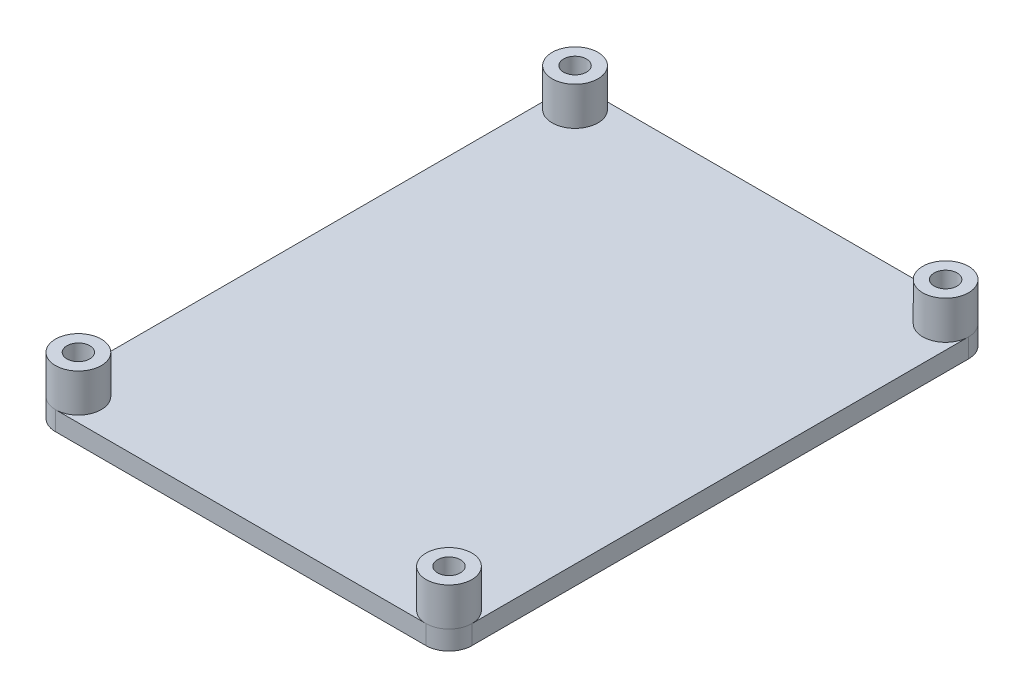
ISO-10303-21;
HEADER;
FILE_DESCRIPTION(('STEP AP214'),'2;1');
FILE_NAME('part.step','',(''),(''),'','','');
FILE_SCHEMA(('AUTOMOTIVE_DESIGN { 1 0 10303 214 1 1 1 1 }'));
ENDSEC;
DATA;
#1=APPLICATION_CONTEXT('core data for automotive mechanical design processes');
#2=APPLICATION_PROTOCOL_DEFINITION('international standard','automotive_design',2000,#1);
#3=PRODUCT_CONTEXT('',#1,'mechanical');
#4=PRODUCT('Part','Part','',(#3));
#5=PRODUCT_RELATED_PRODUCT_CATEGORY('part','',(#4));
#6=PRODUCT_DEFINITION_FORMATION('','',#4);
#7=PRODUCT_DEFINITION_CONTEXT('part definition',#1,'design');
#8=PRODUCT_DEFINITION('design','',#6,#7);
#9=PRODUCT_DEFINITION_SHAPE('','',#8);
#10=(LENGTH_UNIT() NAMED_UNIT(*) SI_UNIT(.MILLI.,.METRE.));
#11=(NAMED_UNIT(*) PLANE_ANGLE_UNIT() SI_UNIT($,.RADIAN.));
#12=(NAMED_UNIT(*) SI_UNIT($,.STERADIAN.) SOLID_ANGLE_UNIT());
#13=UNCERTAINTY_MEASURE_WITH_UNIT(LENGTH_MEASURE(1.E-05),#10,'distance_accuracy_value','');
#14=(GEOMETRIC_REPRESENTATION_CONTEXT(3) GLOBAL_UNCERTAINTY_ASSIGNED_CONTEXT((#13)) GLOBAL_UNIT_ASSIGNED_CONTEXT((#10,
#11,#12)) REPRESENTATION_CONTEXT('',''));
#15=CARTESIAN_POINT('',(0.,0.,0.));
#16=DIRECTION('',(0.,0.,1.));
#17=DIRECTION('',(1.,0.,0.));
#18=AXIS2_PLACEMENT_3D('',#15,#16,#17);
#19=CARTESIAN_POINT('',(0.,2.5,0.));
#20=DIRECTION('',(0.,1.,0.));
#21=DIRECTION('',(0.,0.,1.));
#22=AXIS2_PLACEMENT_3D('',#19,#20,#21);
#23=PLANE('',#22);
#24=DIRECTION('',(0.,0.,1.));
#25=VECTOR('',#24,1.);
#26=CARTESIAN_POINT('',(-70.0973817119404,2.5,15.775024631363));
#27=LINE('',#26,#25);
#28=CARTESIAN_POINT('',(-70.0973817119404,2.5,18.775024631363));
#29=VERTEX_POINT('',#28);
#30=CARTESIAN_POINT('',(-70.0973817119404,2.5,83.775024631363));
#31=VERTEX_POINT('',#30);
#32=EDGE_CURVE('E103',#29,#31,#27,.T.);
#33=ORIENTED_EDGE('',*,*,#32,.T.);
#34=CARTESIAN_POINT('',(-67.0973817119404,2.5,83.775024631363));
#35=DIRECTION('',(0.,1.,0.));
#36=DIRECTION('',(0.,0.,1.));
#37=AXIS2_PLACEMENT_3D('',#34,#35,#36);
#38=CIRCLE('',#37,3.00000000000001);
#39=CARTESIAN_POINT('',(-67.0973817119404,2.5,86.775024631363));
#40=VERTEX_POINT('',#39);
#41=EDGE_CURVE('E113',#40,#31,#38,.T.);
#42=ORIENTED_EDGE('',*,*,#41,.F.);
#43=DIRECTION('',(1.,0.,0.));
#44=VECTOR('',#43,1.);
#45=CARTESIAN_POINT('',(-70.0973817119404,2.5,86.775024631363));
#46=LINE('',#45,#44);
#47=CARTESIAN_POINT('',(-18.5973817119404,2.5,86.775024631363));
#48=VERTEX_POINT('',#47);
#49=EDGE_CURVE('E124',#40,#48,#46,.T.);
#50=ORIENTED_EDGE('',*,*,#49,.T.);
#51=CARTESIAN_POINT('',(-18.5973817119404,2.5,83.775024631363));
#52=DIRECTION('',(0.,1.,0.));
#53=DIRECTION('',(0.,0.,1.));
#54=AXIS2_PLACEMENT_3D('',#51,#52,#53);
#55=CIRCLE('',#54,3.);
#56=CARTESIAN_POINT('',(-15.5973817119404,2.5,83.775024631363));
#57=VERTEX_POINT('',#56);
#58=EDGE_CURVE('E109',#48,#57,#55,.F.);
#59=ORIENTED_EDGE('',*,*,#58,.T.);
#60=DIRECTION('',(0.,0.,-1.));
#61=VECTOR('',#60,1.);
#62=CARTESIAN_POINT('',(-15.5973817119404,2.5,15.775024631363));
#63=LINE('',#62,#61);
#64=CARTESIAN_POINT('',(-15.5973817119404,2.5,18.7750246313629));
#65=VERTEX_POINT('',#64);
#66=EDGE_CURVE('E149',#57,#65,#63,.T.);
#67=ORIENTED_EDGE('',*,*,#66,.T.);
#68=CARTESIAN_POINT('',(-18.5973817119404,2.5,18.7750246313629));
#69=DIRECTION('',(0.,1.,0.));
#70=DIRECTION('',(0.,0.,1.));
#71=AXIS2_PLACEMENT_3D('',#68,#69,#70);
#72=CIRCLE('',#71,3.);
#73=CARTESIAN_POINT('',(-18.5973817119404,2.5,15.775024631363));
#74=VERTEX_POINT('',#73);
#75=EDGE_CURVE('E162',#65,#74,#72,.F.);
#76=ORIENTED_EDGE('',*,*,#75,.T.);
#77=DIRECTION('',(-1.,0.,0.));
#78=VECTOR('',#77,1.);
#79=CARTESIAN_POINT('',(-70.0973817119404,2.5,15.775024631363));
#80=LINE('',#79,#78);
#81=CARTESIAN_POINT('',(-67.0973817119404,2.5,15.7750246313629));
#82=VERTEX_POINT('',#81);
#83=EDGE_CURVE('E152',#74,#82,#80,.T.);
#84=ORIENTED_EDGE('',*,*,#83,.T.);
#85=CARTESIAN_POINT('',(-67.0973817119404,2.5,18.775024631363));
#86=DIRECTION('',(0.,1.,0.));
#87=DIRECTION('',(0.,0.,1.));
#88=AXIS2_PLACEMENT_3D('',#85,#86,#87);
#89=CIRCLE('',#88,3.00000000000001);
#90=EDGE_CURVE('E123',#29,#82,#89,.T.);
#91=ORIENTED_EDGE('',*,*,#90,.F.);
#92=EDGE_LOOP('',(#33,#42,#50,#59,#67,#76,#84,#91));
#93=FACE_BOUND('',#92,.T.);
#94=ADVANCED_FACE('F32',(#93),#23,.T.);
#95=CARTESIAN_POINT('',(-70.0973817119404,2.5,15.775024631363));
#96=DIRECTION('',(1.,0.,0.));
#97=DIRECTION('',(0.,0.,-1.));
#98=AXIS2_PLACEMENT_3D('',#95,#96,#97);
#99=PLANE('',#98);
#100=ORIENTED_EDGE('',*,*,#32,.F.);
#101=DIRECTION('',(0.,-1.,0.));
#102=VECTOR('',#101,1.);
#103=CARTESIAN_POINT('',(-70.0973817119404,2.5,18.775024631363));
#104=LINE('',#103,#102);
#105=CARTESIAN_POINT('',(-70.0973817119404,0.,18.775024631363));
#106=VERTEX_POINT('',#105);
#107=EDGE_CURVE('E108',#29,#106,#104,.T.);
#108=ORIENTED_EDGE('',*,*,#107,.T.);
#109=DIRECTION('',(0.,0.,1.));
#110=VECTOR('',#109,1.);
#111=CARTESIAN_POINT('',(-70.0973817119404,0.,15.775024631363));
#112=LINE('',#111,#110);
#113=CARTESIAN_POINT('',(-70.0973817119404,0.,83.775024631363));
#114=VERTEX_POINT('',#113);
#115=EDGE_CURVE('E106',#106,#114,#112,.T.);
#116=ORIENTED_EDGE('',*,*,#115,.T.);
#117=DIRECTION('',(0.,-1.,0.));
#118=VECTOR('',#117,1.);
#119=CARTESIAN_POINT('',(-70.0973817119404,2.5,83.775024631363));
#120=LINE('',#119,#118);
#121=EDGE_CURVE('E98',#114,#31,#120,.F.);
#122=ORIENTED_EDGE('',*,*,#121,.T.);
#123=EDGE_LOOP('',(#100,#108,#116,#122));
#124=FACE_BOUND('',#123,.T.);
#125=ADVANCED_FACE('F100',(#124),#99,.F.);
#126=CARTESIAN_POINT('',(-70.0973817119404,2.5,86.775024631363));
#127=DIRECTION('',(0.,0.,-1.));
#128=DIRECTION('',(-1.,0.,0.));
#129=AXIS2_PLACEMENT_3D('',#126,#127,#128);
#130=PLANE('',#129);
#131=DIRECTION('',(1.,0.,0.));
#132=VECTOR('',#131,1.);
#133=CARTESIAN_POINT('',(-70.0973817119404,0.,86.775024631363));
#134=LINE('',#133,#132);
#135=CARTESIAN_POINT('',(-67.0973817119404,0.,86.775024631363));
#136=VERTEX_POINT('',#135);
#137=CARTESIAN_POINT('',(-18.5973817119404,0.,86.775024631363));
#138=VERTEX_POINT('',#137);
#139=EDGE_CURVE('E155',#136,#138,#134,.T.);
#140=ORIENTED_EDGE('',*,*,#139,.T.);
#141=DIRECTION('',(0.,-1.,0.));
#142=VECTOR('',#141,1.);
#143=CARTESIAN_POINT('',(-18.5973817119404,2.5,86.775024631363));
#144=LINE('',#143,#142);
#145=EDGE_CURVE('E11',#138,#48,#144,.F.);
#146=ORIENTED_EDGE('',*,*,#145,.T.);
#147=ORIENTED_EDGE('',*,*,#49,.F.);
#148=DIRECTION('',(0.,-1.,0.));
#149=VECTOR('',#148,1.);
#150=CARTESIAN_POINT('',(-67.0973817119404,2.5,86.775024631363));
#151=LINE('',#150,#149);
#152=EDGE_CURVE('E40',#40,#136,#151,.T.);
#153=ORIENTED_EDGE('',*,*,#152,.T.);
#154=EDGE_LOOP('',(#140,#146,#147,#153));
#155=FACE_BOUND('',#154,.T.);
#156=ADVANCED_FACE('F184',(#155),#130,.F.);
#157=CARTESIAN_POINT('',(-15.5973817119404,2.5,15.775024631363));
#158=DIRECTION('',(-1.,0.,0.));
#159=DIRECTION('',(0.,0.,1.));
#160=AXIS2_PLACEMENT_3D('',#157,#158,#159);
#161=PLANE('',#160);
#162=DIRECTION('',(0.,0.,-1.));
#163=VECTOR('',#162,1.);
#164=CARTESIAN_POINT('',(-15.5973817119404,0.,15.775024631363));
#165=LINE('',#164,#163);
#166=CARTESIAN_POINT('',(-15.5973817119404,0.,83.775024631363));
#167=VERTEX_POINT('',#166);
#168=CARTESIAN_POINT('',(-15.5973817119404,0.,18.775024631363));
#169=VERTEX_POINT('',#168);
#170=EDGE_CURVE('E157',#167,#169,#165,.T.);
#171=ORIENTED_EDGE('',*,*,#170,.T.);
#172=DIRECTION('',(0.,-1.,0.));
#173=VECTOR('',#172,1.);
#174=CARTESIAN_POINT('',(-15.5973817119404,2.5,18.775024631363));
#175=LINE('',#174,#173);
#176=EDGE_CURVE('E182',#169,#65,#175,.F.);
#177=ORIENTED_EDGE('',*,*,#176,.T.);
#178=ORIENTED_EDGE('',*,*,#66,.F.);
#179=DIRECTION('',(0.,-1.,0.));
#180=VECTOR('',#179,1.);
#181=CARTESIAN_POINT('',(-15.5973817119404,2.5,83.775024631363));
#182=LINE('',#181,#180);
#183=EDGE_CURVE('E179',#57,#167,#182,.T.);
#184=ORIENTED_EDGE('',*,*,#183,.T.);
#185=EDGE_LOOP('',(#171,#177,#178,#184));
#186=FACE_BOUND('',#185,.T.);
#187=ADVANCED_FACE('F222',(#186),#161,.F.);
#188=CARTESIAN_POINT('',(-70.0973817119404,2.5,15.775024631363));
#189=DIRECTION('',(0.,0.,1.));
#190=DIRECTION('',(1.,0.,0.));
#191=AXIS2_PLACEMENT_3D('',#188,#189,#190);
#192=PLANE('',#191);
#193=DIRECTION('',(-1.,0.,0.));
#194=VECTOR('',#193,1.);
#195=CARTESIAN_POINT('',(-70.0973817119404,0.,15.775024631363));
#196=LINE('',#195,#194);
#197=CARTESIAN_POINT('',(-18.5973817119404,0.,15.775024631363));
#198=VERTEX_POINT('',#197);
#199=CARTESIAN_POINT('',(-67.0973817119404,0.,15.775024631363));
#200=VERTEX_POINT('',#199);
#201=EDGE_CURVE('E125',#198,#200,#196,.T.);
#202=ORIENTED_EDGE('',*,*,#201,.T.);
#203=DIRECTION('',(0.,-1.,0.));
#204=VECTOR('',#203,1.);
#205=CARTESIAN_POINT('',(-67.0973817119404,2.5,15.775024631363));
#206=LINE('',#205,#204);
#207=EDGE_CURVE('E177',#200,#82,#206,.F.);
#208=ORIENTED_EDGE('',*,*,#207,.T.);
#209=ORIENTED_EDGE('',*,*,#83,.F.);
#210=DIRECTION('',(0.,-1.,0.));
#211=VECTOR('',#210,1.);
#212=CARTESIAN_POINT('',(-18.5973817119404,2.5,15.775024631363));
#213=LINE('',#212,#211);
#214=EDGE_CURVE('E174',#74,#198,#213,.T.);
#215=ORIENTED_EDGE('',*,*,#214,.T.);
#216=EDGE_LOOP('',(#202,#208,#209,#215));
#217=FACE_BOUND('',#216,.T.);
#218=ADVANCED_FACE('F192',(#217),#192,.F.);
#219=CARTESIAN_POINT('',(0.,0.,0.));
#220=DIRECTION('',(0.,1.,0.));
#221=DIRECTION('',(0.,0.,1.));
#222=AXIS2_PLACEMENT_3D('',#219,#220,#221);
#223=PLANE('',#222);
#224=CARTESIAN_POINT('',(-67.0973817119404,0.,83.775024631363));
#225=DIRECTION('',(0.,1.,0.));
#226=DIRECTION('',(0.,0.,1.));
#227=AXIS2_PLACEMENT_3D('',#224,#225,#226);
#228=CIRCLE('',#227,1.5);
#229=CARTESIAN_POINT('',(-67.0973817119404,0.,85.275024631363));
#230=VERTEX_POINT('',#229);
#231=EDGE_CURVE('E306',#230,#230,#228,.F.);
#232=ORIENTED_EDGE('',*,*,#231,.F.);
#233=EDGE_LOOP('',(#232));
#234=FACE_BOUND('',#233,.T.);
#235=CARTESIAN_POINT('',(-18.5973817119404,0.,83.775024631363));
#236=DIRECTION('',(0.,1.,0.));
#237=DIRECTION('',(0.,0.,1.));
#238=AXIS2_PLACEMENT_3D('',#235,#236,#237);
#239=CIRCLE('',#238,1.5);
#240=CARTESIAN_POINT('',(-18.5973817119404,0.,85.275024631363));
#241=VERTEX_POINT('',#240);
#242=EDGE_CURVE('E298',#241,#241,#239,.F.);
#243=ORIENTED_EDGE('',*,*,#242,.F.);
#244=EDGE_LOOP('',(#243));
#245=FACE_BOUND('',#244,.T.);
#246=CARTESIAN_POINT('',(-18.5973817119404,0.,18.7750246313629));
#247=DIRECTION('',(0.,1.,0.));
#248=DIRECTION('',(0.,0.,1.));
#249=AXIS2_PLACEMENT_3D('',#246,#247,#248);
#250=CIRCLE('',#249,1.5);
#251=CARTESIAN_POINT('',(-18.5973817119404,0.,20.2750246313629));
#252=VERTEX_POINT('',#251);
#253=EDGE_CURVE('E294',#252,#252,#250,.F.);
#254=ORIENTED_EDGE('',*,*,#253,.F.);
#255=EDGE_LOOP('',(#254));
#256=FACE_BOUND('',#255,.T.);
#257=CARTESIAN_POINT('',(-67.0973817119404,0.,18.775024631363));
#258=DIRECTION('',(0.,1.,0.));
#259=DIRECTION('',(0.,0.,1.));
#260=AXIS2_PLACEMENT_3D('',#257,#258,#259);
#261=CIRCLE('',#260,1.5);
#262=CARTESIAN_POINT('',(-67.0973817119404,0.,20.275024631363));
#263=VERTEX_POINT('',#262);
#264=EDGE_CURVE('E127',#263,#263,#261,.F.);
#265=ORIENTED_EDGE('',*,*,#264,.F.);
#266=EDGE_LOOP('',(#265));
#267=FACE_BOUND('',#266,.T.);
#268=ORIENTED_EDGE('',*,*,#115,.F.);
#269=CARTESIAN_POINT('',(-67.0973817119404,0.,18.775024631363));
#270=DIRECTION('',(0.,1.,0.));
#271=DIRECTION('',(0.,0.,1.));
#272=AXIS2_PLACEMENT_3D('',#269,#270,#271);
#273=CIRCLE('',#272,3.);
#274=EDGE_CURVE('E172',#106,#200,#273,.F.);
#275=ORIENTED_EDGE('',*,*,#274,.T.);
#276=ORIENTED_EDGE('',*,*,#201,.F.);
#277=CARTESIAN_POINT('',(-18.5973817119404,0.,18.775024631363));
#278=DIRECTION('',(0.,1.,0.));
#279=DIRECTION('',(0.,0.,1.));
#280=AXIS2_PLACEMENT_3D('',#277,#278,#279);
#281=CIRCLE('',#280,3.);
#282=EDGE_CURVE('E170',#198,#169,#281,.F.);
#283=ORIENTED_EDGE('',*,*,#282,.T.);
#284=ORIENTED_EDGE('',*,*,#170,.F.);
#285=CARTESIAN_POINT('',(-18.5973817119404,0.,83.775024631363));
#286=DIRECTION('',(0.,1.,0.));
#287=DIRECTION('',(0.,0.,1.));
#288=AXIS2_PLACEMENT_3D('',#285,#286,#287);
#289=CIRCLE('',#288,3.);
#290=EDGE_CURVE('E47',#167,#138,#289,.F.);
#291=ORIENTED_EDGE('',*,*,#290,.T.);
#292=ORIENTED_EDGE('',*,*,#139,.F.);
#293=CARTESIAN_POINT('',(-67.0973817119404,0.,83.775024631363));
#294=DIRECTION('',(0.,1.,0.));
#295=DIRECTION('',(0.,0.,1.));
#296=AXIS2_PLACEMENT_3D('',#293,#294,#295);
#297=CIRCLE('',#296,3.);
#298=EDGE_CURVE('E55',#136,#114,#297,.F.);
#299=ORIENTED_EDGE('',*,*,#298,.T.);
#300=EDGE_LOOP('',(#268,#275,#276,#283,#284,#291,#292,#299));
#301=FACE_BOUND('',#300,.T.);
#302=ADVANCED_FACE('F186',(#234,#245,#256,#267,#301),#223,.F.);
#303=CARTESIAN_POINT('',(-67.0973817119404,7.5,18.775024631363));
#304=DIRECTION('',(0.,-1.,0.));
#305=DIRECTION('',(0.,0.,-1.));
#306=AXIS2_PLACEMENT_3D('',#303,#304,#305);
#307=CYLINDRICAL_SURFACE('',#306,3.00000000000001);
#308=CARTESIAN_POINT('',(-67.0973817119404,7.5,18.775024631363));
#309=DIRECTION('',(0.,1.,0.));
#310=DIRECTION('',(0.,0.,1.));
#311=AXIS2_PLACEMENT_3D('',#308,#309,#310);
#312=CIRCLE('',#311,3.00000000000001);
#313=CARTESIAN_POINT('',(-67.0973817119404,7.5,21.775024631363));
#314=VERTEX_POINT('',#313);
#315=EDGE_CURVE('E144',#314,#314,#312,.T.);
#316=ORIENTED_EDGE('',*,*,#315,.F.);
#317=EDGE_LOOP('',(#316));
#318=FACE_BOUND('',#317,.T.);
#319=EDGE_CURVE('E142',#82,#29,#89,.T.);
#320=ORIENTED_EDGE('',*,*,#319,.T.);
#321=ORIENTED_EDGE('',*,*,#90,.T.);
#322=EDGE_LOOP('',(#320,#321));
#323=FACE_BOUND('',#322,.T.);
#324=ADVANCED_FACE('F198',(#318,#323),#307,.T.);
#325=CARTESIAN_POINT('',(-67.0973817119404,7.5,18.775024631363));
#326=DIRECTION('',(0.,1.,0.));
#327=DIRECTION('',(0.,0.,1.));
#328=AXIS2_PLACEMENT_3D('',#325,#326,#327);
#329=PLANE('',#328);
#330=CARTESIAN_POINT('',(-67.0973817119404,7.5,18.775024631363));
#331=DIRECTION('',(0.,1.,0.));
#332=DIRECTION('',(0.,0.,1.));
#333=AXIS2_PLACEMENT_3D('',#330,#331,#332);
#334=CIRCLE('',#333,1.5);
#335=CARTESIAN_POINT('',(-67.0973817119404,7.5,20.275024631363));
#336=VERTEX_POINT('',#335);
#337=EDGE_CURVE('E129',#336,#336,#334,.T.);
#338=ORIENTED_EDGE('',*,*,#337,.F.);
#339=EDGE_LOOP('',(#338));
#340=FACE_BOUND('',#339,.T.);
#341=ORIENTED_EDGE('',*,*,#315,.T.);
#342=EDGE_LOOP('',(#341));
#343=FACE_BOUND('',#342,.T.);
#344=ADVANCED_FACE('F200',(#340,#343),#329,.T.);
#345=CARTESIAN_POINT('',(-18.5973817119404,7.5,18.7750246313629));
#346=DIRECTION('',(0.,-1.,0.));
#347=DIRECTION('',(0.,0.,-1.));
#348=AXIS2_PLACEMENT_3D('',#345,#346,#347);
#349=CYLINDRICAL_SURFACE('',#348,3.);
#350=CARTESIAN_POINT('',(-18.5973817119404,7.5,18.7750246313629));
#351=DIRECTION('',(0.,1.,0.));
#352=DIRECTION('',(0.,0.,1.));
#353=AXIS2_PLACEMENT_3D('',#350,#351,#352);
#354=CIRCLE('',#353,3.);
#355=CARTESIAN_POINT('',(-18.5973817119404,7.5,21.775024631363));
#356=VERTEX_POINT('',#355);
#357=EDGE_CURVE('E139',#356,#356,#354,.T.);
#358=ORIENTED_EDGE('',*,*,#357,.F.);
#359=EDGE_LOOP('',(#358));
#360=FACE_BOUND('',#359,.T.);
#361=CARTESIAN_POINT('',(-18.5973817119404,2.5,18.7750246313629));
#362=DIRECTION('',(0.,1.,0.));
#363=DIRECTION('',(0.,0.,1.));
#364=AXIS2_PLACEMENT_3D('',#361,#362,#363);
#365=CIRCLE('',#364,3.);
#366=EDGE_CURVE('E136',#65,#74,#365,.T.);
#367=ORIENTED_EDGE('',*,*,#366,.T.);
#368=ORIENTED_EDGE('',*,*,#75,.F.);
#369=EDGE_LOOP('',(#367,#368));
#370=FACE_BOUND('',#369,.T.);
#371=ADVANCED_FACE('F207',(#360,#370),#349,.T.);
#372=CARTESIAN_POINT('',(-18.5973817119404,7.5,18.7750246313629));
#373=DIRECTION('',(0.,1.,0.));
#374=DIRECTION('',(0.,0.,1.));
#375=AXIS2_PLACEMENT_3D('',#372,#373,#374);
#376=PLANE('',#375);
#377=CARTESIAN_POINT('',(-18.5973817119404,7.5,18.7750246313629));
#378=DIRECTION('',(0.,1.,0.));
#379=DIRECTION('',(0.,0.,1.));
#380=AXIS2_PLACEMENT_3D('',#377,#378,#379);
#381=CIRCLE('',#380,1.5);
#382=CARTESIAN_POINT('',(-18.5973817119404,7.5,20.2750246313629));
#383=VERTEX_POINT('',#382);
#384=EDGE_CURVE('E297',#383,#383,#381,.T.);
#385=ORIENTED_EDGE('',*,*,#384,.F.);
#386=EDGE_LOOP('',(#385));
#387=FACE_BOUND('',#386,.T.);
#388=ORIENTED_EDGE('',*,*,#357,.T.);
#389=EDGE_LOOP('',(#388));
#390=FACE_BOUND('',#389,.T.);
#391=ADVANCED_FACE('F252',(#387,#390),#376,.T.);
#392=CARTESIAN_POINT('',(-18.5973817119404,7.5,83.775024631363));
#393=DIRECTION('',(0.,-1.,0.));
#394=DIRECTION('',(0.,0.,-1.));
#395=AXIS2_PLACEMENT_3D('',#392,#393,#394);
#396=CYLINDRICAL_SURFACE('',#395,3.);
#397=CARTESIAN_POINT('',(-18.5973817119404,7.5,83.775024631363));
#398=DIRECTION('',(0.,1.,0.));
#399=DIRECTION('',(0.,0.,1.));
#400=AXIS2_PLACEMENT_3D('',#397,#398,#399);
#401=CIRCLE('',#400,3.);
#402=CARTESIAN_POINT('',(-18.5973817119404,7.5,86.775024631363));
#403=VERTEX_POINT('',#402);
#404=EDGE_CURVE('E133',#403,#403,#401,.T.);
#405=ORIENTED_EDGE('',*,*,#404,.F.);
#406=EDGE_LOOP('',(#405));
#407=FACE_BOUND('',#406,.T.);
#408=CARTESIAN_POINT('',(-18.5973817119404,2.5,83.775024631363));
#409=DIRECTION('',(0.,1.,0.));
#410=DIRECTION('',(0.,0.,1.));
#411=AXIS2_PLACEMENT_3D('',#408,#409,#410);
#412=CIRCLE('',#411,3.);
#413=EDGE_CURVE('E137',#48,#57,#412,.T.);
#414=ORIENTED_EDGE('',*,*,#413,.T.);
#415=ORIENTED_EDGE('',*,*,#58,.F.);
#416=EDGE_LOOP('',(#414,#415));
#417=FACE_BOUND('',#416,.T.);
#418=ADVANCED_FACE('F245',(#407,#417),#396,.T.);
#419=CARTESIAN_POINT('',(-18.5973817119404,7.5,83.775024631363));
#420=DIRECTION('',(0.,1.,0.));
#421=DIRECTION('',(0.,0.,1.));
#422=AXIS2_PLACEMENT_3D('',#419,#420,#421);
#423=PLANE('',#422);
#424=CARTESIAN_POINT('',(-18.5973817119404,7.5,83.775024631363));
#425=DIRECTION('',(0.,1.,0.));
#426=DIRECTION('',(0.,0.,1.));
#427=AXIS2_PLACEMENT_3D('',#424,#425,#426);
#428=CIRCLE('',#427,1.5);
#429=CARTESIAN_POINT('',(-18.5973817119404,7.5,85.275024631363));
#430=VERTEX_POINT('',#429);
#431=EDGE_CURVE('E302',#430,#430,#428,.T.);
#432=ORIENTED_EDGE('',*,*,#431,.F.);
#433=EDGE_LOOP('',(#432));
#434=FACE_BOUND('',#433,.T.);
#435=ORIENTED_EDGE('',*,*,#404,.T.);
#436=EDGE_LOOP('',(#435));
#437=FACE_BOUND('',#436,.T.);
#438=ADVANCED_FACE('F264',(#434,#437),#423,.T.);
#439=CARTESIAN_POINT('',(-67.0973817119404,7.5,83.775024631363));
#440=DIRECTION('',(0.,-1.,0.));
#441=DIRECTION('',(0.,0.,-1.));
#442=AXIS2_PLACEMENT_3D('',#439,#440,#441);
#443=CYLINDRICAL_SURFACE('',#442,3.00000000000001);
#444=CARTESIAN_POINT('',(-67.0973817119404,7.5,83.775024631363));
#445=DIRECTION('',(0.,1.,0.));
#446=DIRECTION('',(0.,0.,1.));
#447=AXIS2_PLACEMENT_3D('',#444,#445,#446);
#448=CIRCLE('',#447,3.00000000000001);
#449=CARTESIAN_POINT('',(-67.0973817119404,7.5,86.775024631363));
#450=VERTEX_POINT('',#449);
#451=EDGE_CURVE('E119',#450,#450,#448,.T.);
#452=ORIENTED_EDGE('',*,*,#451,.F.);
#453=EDGE_LOOP('',(#452));
#454=FACE_BOUND('',#453,.T.);
#455=ORIENTED_EDGE('',*,*,#41,.T.);
#456=EDGE_CURVE('E115',#31,#40,#38,.T.);
#457=ORIENTED_EDGE('',*,*,#456,.T.);
#458=EDGE_LOOP('',(#455,#457));
#459=FACE_BOUND('',#458,.T.);
#460=ADVANCED_FACE('F114',(#454,#459),#443,.T.);
#461=CARTESIAN_POINT('',(-67.0973817119404,7.5,83.775024631363));
#462=DIRECTION('',(0.,1.,0.));
#463=DIRECTION('',(0.,0.,1.));
#464=AXIS2_PLACEMENT_3D('',#461,#462,#463);
#465=PLANE('',#464);
#466=CARTESIAN_POINT('',(-67.0973817119404,7.5,83.775024631363));
#467=DIRECTION('',(0.,1.,0.));
#468=DIRECTION('',(0.,0.,1.));
#469=AXIS2_PLACEMENT_3D('',#466,#467,#468);
#470=CIRCLE('',#469,1.5);
#471=CARTESIAN_POINT('',(-67.0973817119404,7.5,85.275024631363));
#472=VERTEX_POINT('',#471);
#473=EDGE_CURVE('E308',#472,#472,#470,.T.);
#474=ORIENTED_EDGE('',*,*,#473,.F.);
#475=EDGE_LOOP('',(#474));
#476=FACE_BOUND('',#475,.T.);
#477=ORIENTED_EDGE('',*,*,#451,.T.);
#478=EDGE_LOOP('',(#477));
#479=FACE_BOUND('',#478,.T.);
#480=ADVANCED_FACE('F231',(#476,#479),#465,.T.);
#481=CARTESIAN_POINT('',(-67.0973817119404,2.5,18.775024631363));
#482=DIRECTION('',(0.,-1.,0.));
#483=DIRECTION('',(0.,0.,-1.));
#484=AXIS2_PLACEMENT_3D('',#481,#482,#483);
#485=CYLINDRICAL_SURFACE('',#484,3.);
#486=ORIENTED_EDGE('',*,*,#319,.F.);
#487=ORIENTED_EDGE('',*,*,#207,.F.);
#488=ORIENTED_EDGE('',*,*,#274,.F.);
#489=ORIENTED_EDGE('',*,*,#107,.F.);
#490=EDGE_LOOP('',(#486,#487,#488,#489));
#491=FACE_BOUND('',#490,.T.);
#492=ADVANCED_FACE('F196',(#491),#485,.T.);
#493=CARTESIAN_POINT('',(-18.5973817119404,2.5,18.775024631363));
#494=DIRECTION('',(0.,-1.,0.));
#495=DIRECTION('',(0.,0.,-1.));
#496=AXIS2_PLACEMENT_3D('',#493,#494,#495);
#497=CYLINDRICAL_SURFACE('',#496,3.);
#498=ORIENTED_EDGE('',*,*,#366,.F.);
#499=ORIENTED_EDGE('',*,*,#176,.F.);
#500=ORIENTED_EDGE('',*,*,#282,.F.);
#501=ORIENTED_EDGE('',*,*,#214,.F.);
#502=EDGE_LOOP('',(#498,#499,#500,#501));
#503=FACE_BOUND('',#502,.T.);
#504=ADVANCED_FACE('F230',(#503),#497,.T.);
#505=CARTESIAN_POINT('',(-18.5973817119404,2.5,83.775024631363));
#506=DIRECTION('',(0.,-1.,0.));
#507=DIRECTION('',(0.,0.,-1.));
#508=AXIS2_PLACEMENT_3D('',#505,#506,#507);
#509=CYLINDRICAL_SURFACE('',#508,3.);
#510=ORIENTED_EDGE('',*,*,#413,.F.);
#511=ORIENTED_EDGE('',*,*,#145,.F.);
#512=ORIENTED_EDGE('',*,*,#290,.F.);
#513=ORIENTED_EDGE('',*,*,#183,.F.);
#514=EDGE_LOOP('',(#510,#511,#512,#513));
#515=FACE_BOUND('',#514,.T.);
#516=ADVANCED_FACE('F233',(#515),#509,.T.);
#517=CARTESIAN_POINT('',(-67.0973817119404,2.5,83.775024631363));
#518=DIRECTION('',(0.,-1.,0.));
#519=DIRECTION('',(0.,0.,-1.));
#520=AXIS2_PLACEMENT_3D('',#517,#518,#519);
#521=CYLINDRICAL_SURFACE('',#520,3.);
#522=ORIENTED_EDGE('',*,*,#456,.F.);
#523=ORIENTED_EDGE('',*,*,#121,.F.);
#524=ORIENTED_EDGE('',*,*,#298,.F.);
#525=ORIENTED_EDGE('',*,*,#152,.F.);
#526=EDGE_LOOP('',(#522,#523,#524,#525));
#527=FACE_BOUND('',#526,.T.);
#528=ADVANCED_FACE('F34',(#527),#521,.T.);
#529=CARTESIAN_POINT('',(-67.0973817119404,-4.24264068711929,83.775024631363));
#530=DIRECTION('',(0.,1.,0.));
#531=DIRECTION('',(0.,0.,1.));
#532=AXIS2_PLACEMENT_3D('',#529,#530,#531);
#533=CYLINDRICAL_SURFACE('',#532,1.5);
#534=ORIENTED_EDGE('',*,*,#231,.T.);
#535=EDGE_LOOP('',(#534));
#536=FACE_BOUND('',#535,.T.);
#537=ORIENTED_EDGE('',*,*,#473,.T.);
#538=EDGE_LOOP('',(#537));
#539=FACE_BOUND('',#538,.T.);
#540=ADVANCED_FACE('F240',(#536,#539),#533,.F.);
#541=CARTESIAN_POINT('',(-18.5973817119404,-4.24264068711929,83.775024631363));
#542=DIRECTION('',(0.,1.,0.));
#543=DIRECTION('',(0.,0.,1.));
#544=AXIS2_PLACEMENT_3D('',#541,#542,#543);
#545=CYLINDRICAL_SURFACE('',#544,1.5);
#546=ORIENTED_EDGE('',*,*,#242,.T.);
#547=EDGE_LOOP('',(#546));
#548=FACE_BOUND('',#547,.T.);
#549=ORIENTED_EDGE('',*,*,#431,.T.);
#550=EDGE_LOOP('',(#549));
#551=FACE_BOUND('',#550,.T.);
#552=ADVANCED_FACE('F282',(#548,#551),#545,.F.);
#553=CARTESIAN_POINT('',(-18.5973817119404,-4.24264068711929,18.7750246313629));
#554=DIRECTION('',(0.,1.,0.));
#555=DIRECTION('',(0.,0.,1.));
#556=AXIS2_PLACEMENT_3D('',#553,#554,#555);
#557=CYLINDRICAL_SURFACE('',#556,1.5);
#558=ORIENTED_EDGE('',*,*,#253,.T.);
#559=EDGE_LOOP('',(#558));
#560=FACE_BOUND('',#559,.T.);
#561=ORIENTED_EDGE('',*,*,#384,.T.);
#562=EDGE_LOOP('',(#561));
#563=FACE_BOUND('',#562,.T.);
#564=ADVANCED_FACE('F278',(#560,#563),#557,.F.);
#565=CARTESIAN_POINT('',(-67.0973817119404,-4.24264068711929,18.775024631363));
#566=DIRECTION('',(0.,1.,0.));
#567=DIRECTION('',(0.,0.,1.));
#568=AXIS2_PLACEMENT_3D('',#565,#566,#567);
#569=CYLINDRICAL_SURFACE('',#568,1.5);
#570=ORIENTED_EDGE('',*,*,#264,.T.);
#571=EDGE_LOOP('',(#570));
#572=FACE_BOUND('',#571,.T.);
#573=ORIENTED_EDGE('',*,*,#337,.T.);
#574=EDGE_LOOP('',(#573));
#575=FACE_BOUND('',#574,.T.);
#576=ADVANCED_FACE('F275',(#572,#575),#569,.F.);
#577=CLOSED_SHELL('',(#94,#125,#156,#187,#218,#302,#324,#344,#371,#391,#418,#438,#460,#480,#492,
#504,#516,#528,#540,#552,#564,#576));
#578=MANIFOLD_SOLID_BREP('B2',#577);
#579=ADVANCED_BREP_SHAPE_REPRESENTATION('',(#18,#578),#14);
#580=SHAPE_DEFINITION_REPRESENTATION(#9,#579);
ENDSEC;
END-ISO-10303-21;
